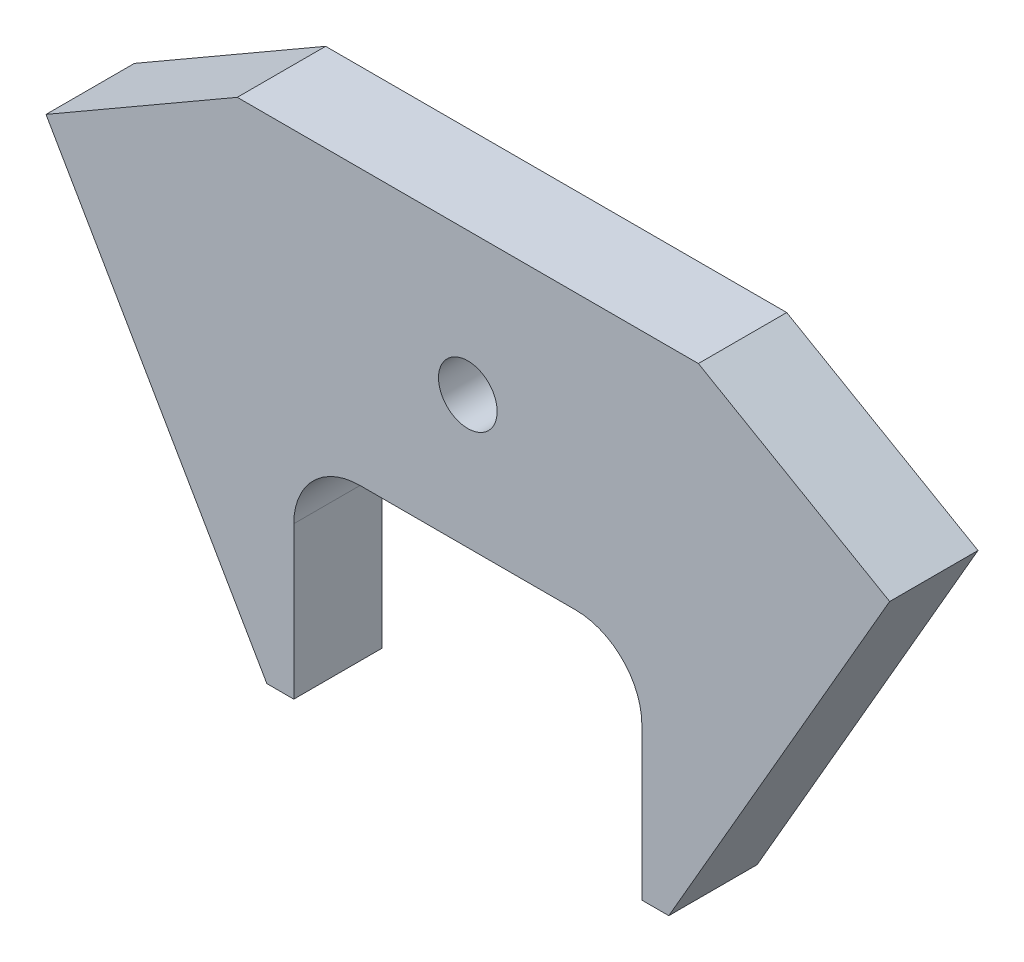
ISO-10303-21;
HEADER;
FILE_DESCRIPTION(('STEP AP214'),'2;1');
FILE_NAME('part.step','',(''),(''),'','','');
FILE_SCHEMA(('AUTOMOTIVE_DESIGN { 1 0 10303 214 1 1 1 1 }'));
ENDSEC;
DATA;
#1=APPLICATION_CONTEXT('core data for automotive mechanical design processes');
#2=APPLICATION_PROTOCOL_DEFINITION('international standard','automotive_design',2000,#1);
#3=PRODUCT_CONTEXT('',#1,'mechanical');
#4=PRODUCT('Part','Part','',(#3));
#5=PRODUCT_RELATED_PRODUCT_CATEGORY('part','',(#4));
#6=PRODUCT_DEFINITION_FORMATION('','',#4);
#7=PRODUCT_DEFINITION_CONTEXT('part definition',#1,'design');
#8=PRODUCT_DEFINITION('design','',#6,#7);
#9=PRODUCT_DEFINITION_SHAPE('','',#8);
#10=(LENGTH_UNIT() NAMED_UNIT(*) SI_UNIT(.MILLI.,.METRE.));
#11=(NAMED_UNIT(*) PLANE_ANGLE_UNIT() SI_UNIT($,.RADIAN.));
#12=(NAMED_UNIT(*) SI_UNIT($,.STERADIAN.) SOLID_ANGLE_UNIT());
#13=UNCERTAINTY_MEASURE_WITH_UNIT(LENGTH_MEASURE(1.E-05),#10,'distance_accuracy_value','');
#14=(GEOMETRIC_REPRESENTATION_CONTEXT(3) GLOBAL_UNCERTAINTY_ASSIGNED_CONTEXT((#13)) GLOBAL_UNIT_ASSIGNED_CONTEXT((#10,
#11,#12)) REPRESENTATION_CONTEXT('',''));
#15=CARTESIAN_POINT('',(0.,0.,0.));
#16=DIRECTION('',(0.,0.,1.));
#17=DIRECTION('',(1.,0.,0.));
#18=AXIS2_PLACEMENT_3D('',#15,#16,#17);
#19=CARTESIAN_POINT('',(25.019,31.369,12.7));
#20=DIRECTION('',(1.,0.,0.));
#21=DIRECTION('',(0.,0.,-1.));
#22=AXIS2_PLACEMENT_3D('',#19,#20,#21);
#23=PLANE('',#22);
#24=DIRECTION('',(0.,-1.,0.));
#25=VECTOR('',#24,1.);
#26=CARTESIAN_POINT('',(25.019,31.369,12.7));
#27=LINE('',#26,#25);
#28=CARTESIAN_POINT('',(25.019,21.844,12.7));
#29=VERTEX_POINT('',#28);
#30=CARTESIAN_POINT('',(25.019,0.,12.7));
#31=VERTEX_POINT('',#30);
#32=EDGE_CURVE('E123',#29,#31,#27,.T.);
#33=ORIENTED_EDGE('',*,*,#32,.F.);
#34=DIRECTION('',(0.,0.,-1.));
#35=VECTOR('',#34,1.);
#36=CARTESIAN_POINT('',(25.019,21.844,0.));
#37=LINE('',#36,#35);
#38=CARTESIAN_POINT('',(25.019,21.844,0.));
#39=VERTEX_POINT('',#38);
#40=EDGE_CURVE('E149',#29,#39,#37,.T.);
#41=ORIENTED_EDGE('',*,*,#40,.T.);
#42=DIRECTION('',(0.,-1.,0.));
#43=VECTOR('',#42,1.);
#44=CARTESIAN_POINT('',(25.019,31.369,0.));
#45=LINE('',#44,#43);
#46=CARTESIAN_POINT('',(25.019,0.,0.));
#47=VERTEX_POINT('',#46);
#48=EDGE_CURVE('E147',#39,#47,#45,.T.);
#49=ORIENTED_EDGE('',*,*,#48,.T.);
#50=DIRECTION('',(0.,0.,-1.));
#51=VECTOR('',#50,1.);
#52=CARTESIAN_POINT('',(25.019,0.,12.7));
#53=LINE('',#52,#51);
#54=EDGE_CURVE('E140',#31,#47,#53,.T.);
#55=ORIENTED_EDGE('',*,*,#54,.F.);
#56=EDGE_LOOP('',(#33,#41,#49,#55));
#57=FACE_BOUND('',#56,.T.);
#58=ADVANCED_FACE('F35',(#57),#23,.F.);
#59=CARTESIAN_POINT('',(25.019,0.,12.7));
#60=DIRECTION('',(0.,1.,0.));
#61=DIRECTION('',(-1.,0.,0.));
#62=AXIS2_PLACEMENT_3D('',#59,#60,#61);
#63=PLANE('',#62);
#64=DIRECTION('',(1.,0.,0.));
#65=VECTOR('',#64,1.);
#66=CARTESIAN_POINT('',(25.019,0.,0.));
#67=LINE('',#66,#65);
#68=CARTESIAN_POINT('',(28.8894527697106,0.,0.));
#69=VERTEX_POINT('',#68);
#70=EDGE_CURVE('E254',#47,#69,#67,.T.);
#71=ORIENTED_EDGE('',*,*,#70,.T.);
#72=DIRECTION('',(0.,0.,-1.));
#73=VECTOR('',#72,1.);
#74=CARTESIAN_POINT('',(28.8894527697106,0.,12.7));
#75=LINE('',#74,#73);
#76=CARTESIAN_POINT('',(28.8894527697106,0.,12.7));
#77=VERTEX_POINT('',#76);
#78=EDGE_CURVE('E142',#77,#69,#75,.T.);
#79=ORIENTED_EDGE('',*,*,#78,.F.);
#80=DIRECTION('',(1.,0.,0.));
#81=VECTOR('',#80,1.);
#82=CARTESIAN_POINT('',(25.019,0.,12.7));
#83=LINE('',#82,#81);
#84=EDGE_CURVE('E127',#31,#77,#83,.T.);
#85=ORIENTED_EDGE('',*,*,#84,.F.);
#86=ORIENTED_EDGE('',*,*,#54,.T.);
#87=EDGE_LOOP('',(#71,#79,#85,#86));
#88=FACE_BOUND('',#87,.T.);
#89=ADVANCED_FACE('F139',(#88),#63,.F.);
#90=CARTESIAN_POINT('',(28.8894527697106,0.,12.7));
#91=DIRECTION('',(-0.866025403784438,0.500000000000001,0.));
#92=DIRECTION('',(-0.500000000000001,-0.866025403784438,0.));
#93=AXIS2_PLACEMENT_3D('',#90,#91,#92);
#94=PLANE('',#93);
#95=DIRECTION('',(0.500000000000001,0.866025403784438,0.));
#96=VECTOR('',#95,1.);
#97=CARTESIAN_POINT('',(28.8894527697106,0.,0.));
#98=LINE('',#97,#96);
#99=CARTESIAN_POINT('',(60.6394527697106,54.9926131403119,0.));
#100=VERTEX_POINT('',#99);
#101=EDGE_CURVE('E256',#69,#100,#98,.T.);
#102=ORIENTED_EDGE('',*,*,#101,.T.);
#103=DIRECTION('',(0.,0.,-1.));
#104=VECTOR('',#103,1.);
#105=CARTESIAN_POINT('',(60.6394527697106,54.9926131403119,12.7));
#106=LINE('',#105,#104);
#107=CARTESIAN_POINT('',(60.6394527697106,54.9926131403119,12.7));
#108=VERTEX_POINT('',#107);
#109=EDGE_CURVE('E153',#108,#100,#106,.T.);
#110=ORIENTED_EDGE('',*,*,#109,.F.);
#111=DIRECTION('',(0.500000000000001,0.866025403784438,0.));
#112=VECTOR('',#111,1.);
#113=CARTESIAN_POINT('',(28.8894527697106,0.,12.7));
#114=LINE('',#113,#112);
#115=EDGE_CURVE('E144',#77,#108,#114,.T.);
#116=ORIENTED_EDGE('',*,*,#115,.F.);
#117=ORIENTED_EDGE('',*,*,#78,.T.);
#118=EDGE_LOOP('',(#102,#110,#116,#117));
#119=FACE_BOUND('',#118,.T.);
#120=ADVANCED_FACE('F189',(#119),#94,.F.);
#121=CARTESIAN_POINT('',(33.1431461995548,70.867613140312,12.7));
#122=DIRECTION('',(-0.500000000000002,-0.866025403784438,0.));
#123=DIRECTION('',(0.866025403784438,-0.500000000000002,0.));
#124=AXIS2_PLACEMENT_3D('',#121,#122,#123);
#125=PLANE('',#124);
#126=DIRECTION('',(-0.866025403784438,0.500000000000002,0.));
#127=VECTOR('',#126,1.);
#128=CARTESIAN_POINT('',(33.1431461995548,70.867613140312,0.));
#129=LINE('',#128,#127);
#130=CARTESIAN_POINT('',(33.1431461995548,70.867613140312,0.));
#131=VERTEX_POINT('',#130);
#132=EDGE_CURVE('E258',#100,#131,#129,.T.);
#133=ORIENTED_EDGE('',*,*,#132,.T.);
#134=DIRECTION('',(0.,0.,-1.));
#135=VECTOR('',#134,1.);
#136=CARTESIAN_POINT('',(33.1431461995548,70.867613140312,12.7));
#137=LINE('',#136,#135);
#138=CARTESIAN_POINT('',(33.1431461995548,70.867613140312,12.7));
#139=VERTEX_POINT('',#138);
#140=EDGE_CURVE('E280',#139,#131,#137,.T.);
#141=ORIENTED_EDGE('',*,*,#140,.F.);
#142=DIRECTION('',(-0.866025403784438,0.500000000000002,0.));
#143=VECTOR('',#142,1.);
#144=CARTESIAN_POINT('',(33.1431461995548,70.867613140312,12.7));
#145=LINE('',#144,#143);
#146=EDGE_CURVE('E238',#108,#139,#145,.T.);
#147=ORIENTED_EDGE('',*,*,#146,.F.);
#148=ORIENTED_EDGE('',*,*,#109,.T.);
#149=EDGE_LOOP('',(#133,#141,#147,#148));
#150=FACE_BOUND('',#149,.T.);
#151=ADVANCED_FACE('F194',(#150),#125,.F.);
#152=CARTESIAN_POINT('',(-33.1431461995548,70.867613140312,12.7));
#153=DIRECTION('',(0.,-1.,0.));
#154=DIRECTION('',(0.,0.,-1.));
#155=AXIS2_PLACEMENT_3D('',#152,#153,#154);
#156=PLANE('',#155);
#157=DIRECTION('',(-1.,0.,0.));
#158=VECTOR('',#157,1.);
#159=CARTESIAN_POINT('',(-33.1431461995548,70.867613140312,0.));
#160=LINE('',#159,#158);
#161=CARTESIAN_POINT('',(-33.1431461995548,70.867613140312,0.));
#162=VERTEX_POINT('',#161);
#163=EDGE_CURVE('E260',#131,#162,#160,.T.);
#164=ORIENTED_EDGE('',*,*,#163,.T.);
#165=DIRECTION('',(0.,0.,-1.));
#166=VECTOR('',#165,1.);
#167=CARTESIAN_POINT('',(-33.1431461995548,70.867613140312,12.7));
#168=LINE('',#167,#166);
#169=CARTESIAN_POINT('',(-33.1431461995548,70.867613140312,12.7));
#170=VERTEX_POINT('',#169);
#171=EDGE_CURVE('E277',#170,#162,#168,.T.);
#172=ORIENTED_EDGE('',*,*,#171,.F.);
#173=DIRECTION('',(-1.,0.,0.));
#174=VECTOR('',#173,1.);
#175=CARTESIAN_POINT('',(-33.1431461995548,70.867613140312,12.7));
#176=LINE('',#175,#174);
#177=EDGE_CURVE('E240',#139,#170,#176,.T.);
#178=ORIENTED_EDGE('',*,*,#177,.F.);
#179=ORIENTED_EDGE('',*,*,#140,.T.);
#180=EDGE_LOOP('',(#164,#172,#178,#179));
#181=FACE_BOUND('',#180,.T.);
#182=ADVANCED_FACE('F198',(#181),#156,.F.);
#183=CARTESIAN_POINT('',(-60.6394527697106,54.9926131403119,12.7));
#184=DIRECTION('',(0.500000000000002,-0.866025403784438,0.));
#185=DIRECTION('',(0.866025403784438,0.500000000000002,0.));
#186=AXIS2_PLACEMENT_3D('',#183,#184,#185);
#187=PLANE('',#186);
#188=DIRECTION('',(-0.866025403784438,-0.500000000000002,0.));
#189=VECTOR('',#188,1.);
#190=CARTESIAN_POINT('',(-60.6394527697106,54.9926131403119,0.));
#191=LINE('',#190,#189);
#192=CARTESIAN_POINT('',(-60.6394527697106,54.9926131403119,0.));
#193=VERTEX_POINT('',#192);
#194=EDGE_CURVE('E262',#162,#193,#191,.T.);
#195=ORIENTED_EDGE('',*,*,#194,.T.);
#196=DIRECTION('',(0.,0.,-1.));
#197=VECTOR('',#196,1.);
#198=CARTESIAN_POINT('',(-60.6394527697106,54.9926131403119,12.7));
#199=LINE('',#198,#197);
#200=CARTESIAN_POINT('',(-60.6394527697106,54.9926131403119,12.7));
#201=VERTEX_POINT('',#200);
#202=EDGE_CURVE('E274',#201,#193,#199,.T.);
#203=ORIENTED_EDGE('',*,*,#202,.F.);
#204=DIRECTION('',(-0.866025403784438,-0.500000000000002,0.));
#205=VECTOR('',#204,1.);
#206=CARTESIAN_POINT('',(-60.6394527697106,54.9926131403119,12.7));
#207=LINE('',#206,#205);
#208=EDGE_CURVE('E242',#170,#201,#207,.T.);
#209=ORIENTED_EDGE('',*,*,#208,.F.);
#210=ORIENTED_EDGE('',*,*,#171,.T.);
#211=EDGE_LOOP('',(#195,#203,#209,#210));
#212=FACE_BOUND('',#211,.T.);
#213=ADVANCED_FACE('F202',(#212),#187,.F.);
#214=CARTESIAN_POINT('',(-28.8894527697106,0.,12.7));
#215=DIRECTION('',(0.866025403784438,0.500000000000001,0.));
#216=DIRECTION('',(-0.500000000000001,0.866025403784438,0.));
#217=AXIS2_PLACEMENT_3D('',#214,#215,#216);
#218=PLANE('',#217);
#219=DIRECTION('',(0.500000000000001,-0.866025403784438,0.));
#220=VECTOR('',#219,1.);
#221=CARTESIAN_POINT('',(-28.8894527697106,0.,0.));
#222=LINE('',#221,#220);
#223=CARTESIAN_POINT('',(-28.8894527697106,0.,0.));
#224=VERTEX_POINT('',#223);
#225=EDGE_CURVE('E264',#193,#224,#222,.T.);
#226=ORIENTED_EDGE('',*,*,#225,.T.);
#227=DIRECTION('',(0.,0.,-1.));
#228=VECTOR('',#227,1.);
#229=CARTESIAN_POINT('',(-28.8894527697106,0.,12.7));
#230=LINE('',#229,#228);
#231=CARTESIAN_POINT('',(-28.8894527697106,0.,12.7));
#232=VERTEX_POINT('',#231);
#233=EDGE_CURVE('E271',#232,#224,#230,.T.);
#234=ORIENTED_EDGE('',*,*,#233,.F.);
#235=DIRECTION('',(0.500000000000001,-0.866025403784438,0.));
#236=VECTOR('',#235,1.);
#237=CARTESIAN_POINT('',(-28.8894527697106,0.,12.7));
#238=LINE('',#237,#236);
#239=EDGE_CURVE('E244',#201,#232,#238,.T.);
#240=ORIENTED_EDGE('',*,*,#239,.F.);
#241=ORIENTED_EDGE('',*,*,#202,.T.);
#242=EDGE_LOOP('',(#226,#234,#240,#241));
#243=FACE_BOUND('',#242,.T.);
#244=ADVANCED_FACE('F206',(#243),#218,.F.);
#245=CARTESIAN_POINT('',(-25.019,0.,12.7));
#246=DIRECTION('',(0.,1.,0.));
#247=DIRECTION('',(-1.,0.,0.));
#248=AXIS2_PLACEMENT_3D('',#245,#246,#247);
#249=PLANE('',#248);
#250=DIRECTION('',(1.,0.,0.));
#251=VECTOR('',#250,1.);
#252=CARTESIAN_POINT('',(-25.019,0.,0.));
#253=LINE('',#252,#251);
#254=CARTESIAN_POINT('',(-25.019,0.,0.));
#255=VERTEX_POINT('',#254);
#256=EDGE_CURVE('E266',#224,#255,#253,.T.);
#257=ORIENTED_EDGE('',*,*,#256,.T.);
#258=DIRECTION('',(0.,0.,-1.));
#259=VECTOR('',#258,1.);
#260=CARTESIAN_POINT('',(-25.019,0.,12.7));
#261=LINE('',#260,#259);
#262=CARTESIAN_POINT('',(-25.019,0.,12.7));
#263=VERTEX_POINT('',#262);
#264=EDGE_CURVE('E252',#263,#255,#261,.T.);
#265=ORIENTED_EDGE('',*,*,#264,.F.);
#266=DIRECTION('',(1.,0.,0.));
#267=VECTOR('',#266,1.);
#268=CARTESIAN_POINT('',(-25.019,0.,12.7));
#269=LINE('',#268,#267);
#270=EDGE_CURVE('E246',#232,#263,#269,.T.);
#271=ORIENTED_EDGE('',*,*,#270,.F.);
#272=ORIENTED_EDGE('',*,*,#233,.T.);
#273=EDGE_LOOP('',(#257,#265,#271,#272));
#274=FACE_BOUND('',#273,.T.);
#275=ADVANCED_FACE('F210',(#274),#249,.F.);
#276=CARTESIAN_POINT('',(-25.019,0.,12.7));
#277=DIRECTION('',(-1.,0.,0.));
#278=DIRECTION('',(0.,0.,1.));
#279=AXIS2_PLACEMENT_3D('',#276,#277,#278);
#280=PLANE('',#279);
#281=DIRECTION('',(0.,1.,0.));
#282=VECTOR('',#281,1.);
#283=CARTESIAN_POINT('',(-25.019,0.,0.));
#284=LINE('',#283,#282);
#285=CARTESIAN_POINT('',(-25.019,21.844,0.));
#286=VERTEX_POINT('',#285);
#287=EDGE_CURVE('E172',#255,#286,#284,.T.);
#288=ORIENTED_EDGE('',*,*,#287,.T.);
#289=DIRECTION('',(0.,0.,-1.));
#290=VECTOR('',#289,1.);
#291=CARTESIAN_POINT('',(-25.019,21.844,12.7));
#292=LINE('',#291,#290);
#293=CARTESIAN_POINT('',(-25.019,21.844,12.7));
#294=VERTEX_POINT('',#293);
#295=EDGE_CURVE('E50',#286,#294,#292,.F.);
#296=ORIENTED_EDGE('',*,*,#295,.T.);
#297=DIRECTION('',(0.,1.,0.));
#298=VECTOR('',#297,1.);
#299=CARTESIAN_POINT('',(-25.019,0.,12.7));
#300=LINE('',#299,#298);
#301=EDGE_CURVE('E248',#263,#294,#300,.T.);
#302=ORIENTED_EDGE('',*,*,#301,.F.);
#303=ORIENTED_EDGE('',*,*,#264,.T.);
#304=EDGE_LOOP('',(#288,#296,#302,#303));
#305=FACE_BOUND('',#304,.T.);
#306=ADVANCED_FACE('F214',(#305),#280,.F.);
#307=CARTESIAN_POINT('',(-25.019,31.369,12.7));
#308=DIRECTION('',(0.,1.,0.));
#309=DIRECTION('',(0.,0.,1.));
#310=AXIS2_PLACEMENT_3D('',#307,#308,#309);
#311=PLANE('',#310);
#312=DIRECTION('',(1.,0.,0.));
#313=VECTOR('',#312,1.);
#314=CARTESIAN_POINT('',(-25.019,31.369,0.));
#315=LINE('',#314,#313);
#316=CARTESIAN_POINT('',(-15.494,31.369,0.));
#317=VERTEX_POINT('',#316);
#318=CARTESIAN_POINT('',(15.494,31.369,0.));
#319=VERTEX_POINT('',#318);
#320=EDGE_CURVE('E135',#317,#319,#315,.T.);
#321=ORIENTED_EDGE('',*,*,#320,.T.);
#322=DIRECTION('',(0.,0.,-1.));
#323=VECTOR('',#322,1.);
#324=CARTESIAN_POINT('',(15.494,31.369,12.7));
#325=LINE('',#324,#323);
#326=CARTESIAN_POINT('',(15.494,31.369,12.7));
#327=VERTEX_POINT('',#326);
#328=EDGE_CURVE('E159',#319,#327,#325,.F.);
#329=ORIENTED_EDGE('',*,*,#328,.T.);
#330=DIRECTION('',(1.,0.,0.));
#331=VECTOR('',#330,1.);
#332=CARTESIAN_POINT('',(-25.019,31.369,12.7));
#333=LINE('',#332,#331);
#334=CARTESIAN_POINT('',(-15.494,31.369,12.7));
#335=VERTEX_POINT('',#334);
#336=EDGE_CURVE('E250',#335,#327,#333,.T.);
#337=ORIENTED_EDGE('',*,*,#336,.F.);
#338=DIRECTION('',(0.,0.,-1.));
#339=VECTOR('',#338,1.);
#340=CARTESIAN_POINT('',(-15.494,31.369,0.));
#341=LINE('',#340,#339);
#342=EDGE_CURVE('E151',#335,#317,#341,.T.);
#343=ORIENTED_EDGE('',*,*,#342,.T.);
#344=EDGE_LOOP('',(#321,#329,#337,#343));
#345=FACE_BOUND('',#344,.T.);
#346=ADVANCED_FACE('F169',(#345),#311,.F.);
#347=CARTESIAN_POINT('',(0.,0.,12.7));
#348=DIRECTION('',(0.,0.,1.));
#349=DIRECTION('',(1.,0.,0.));
#350=AXIS2_PLACEMENT_3D('',#347,#348,#349);
#351=PLANE('',#350);
#352=CARTESIAN_POINT('',(0.,50.419,12.7));
#353=DIRECTION('',(0.,0.,-1.));
#354=DIRECTION('',(-1.,0.,0.));
#355=AXIS2_PLACEMENT_3D('',#352,#353,#354);
#356=CIRCLE('',#355,4.2164);
#357=CARTESIAN_POINT('',(-4.21639999999999,50.419,12.7));
#358=VERTEX_POINT('',#357);
#359=EDGE_CURVE('E230',#358,#358,#356,.T.);
#360=ORIENTED_EDGE('',*,*,#359,.T.);
#361=EDGE_LOOP('',(#360));
#362=FACE_BOUND('',#361,.T.);
#363=ORIENTED_EDGE('',*,*,#336,.T.);
#364=CARTESIAN_POINT('',(15.494,21.844,12.7));
#365=DIRECTION('',(0.,0.,1.));
#366=DIRECTION('',(1.,0.,0.));
#367=AXIS2_PLACEMENT_3D('',#364,#365,#366);
#368=CIRCLE('',#367,9.525);
#369=EDGE_CURVE('E130',#327,#29,#368,.F.);
#370=ORIENTED_EDGE('',*,*,#369,.T.);
#371=ORIENTED_EDGE('',*,*,#32,.T.);
#372=ORIENTED_EDGE('',*,*,#84,.T.);
#373=ORIENTED_EDGE('',*,*,#115,.T.);
#374=ORIENTED_EDGE('',*,*,#146,.T.);
#375=ORIENTED_EDGE('',*,*,#177,.T.);
#376=ORIENTED_EDGE('',*,*,#208,.T.);
#377=ORIENTED_EDGE('',*,*,#239,.T.);
#378=ORIENTED_EDGE('',*,*,#270,.T.);
#379=ORIENTED_EDGE('',*,*,#301,.T.);
#380=CARTESIAN_POINT('',(-15.494,21.844,12.7));
#381=DIRECTION('',(0.,0.,1.));
#382=DIRECTION('',(1.,0.,0.));
#383=AXIS2_PLACEMENT_3D('',#380,#381,#382);
#384=CIRCLE('',#383,9.525);
#385=EDGE_CURVE('E11',#294,#335,#384,.F.);
#386=ORIENTED_EDGE('',*,*,#385,.T.);
#387=EDGE_LOOP('',(#363,#370,#371,#372,#373,#374,#375,#376,#377,#378,#379,#386));
#388=FACE_BOUND('',#387,.T.);
#389=ADVANCED_FACE('F126',(#362,#388),#351,.T.);
#390=CARTESIAN_POINT('',(0.,0.,0.));
#391=DIRECTION('',(0.,0.,1.));
#392=DIRECTION('',(1.,0.,0.));
#393=AXIS2_PLACEMENT_3D('',#390,#391,#392);
#394=PLANE('',#393);
#395=CARTESIAN_POINT('',(0.,50.419,0.));
#396=DIRECTION('',(0.,0.,-1.));
#397=DIRECTION('',(-1.,0.,0.));
#398=AXIS2_PLACEMENT_3D('',#395,#396,#397);
#399=CIRCLE('',#398,4.2164);
#400=CARTESIAN_POINT('',(-4.2164,50.419,0.));
#401=VERTEX_POINT('',#400);
#402=EDGE_CURVE('E233',#401,#401,#399,.T.);
#403=ORIENTED_EDGE('',*,*,#402,.F.);
#404=EDGE_LOOP('',(#403));
#405=FACE_BOUND('',#404,.T.);
#406=ORIENTED_EDGE('',*,*,#48,.F.);
#407=CARTESIAN_POINT('',(15.494,21.844,0.));
#408=DIRECTION('',(0.,0.,1.));
#409=DIRECTION('',(1.,0.,0.));
#410=AXIS2_PLACEMENT_3D('',#407,#408,#409);
#411=CIRCLE('',#410,9.525);
#412=EDGE_CURVE('E162',#39,#319,#411,.T.);
#413=ORIENTED_EDGE('',*,*,#412,.T.);
#414=ORIENTED_EDGE('',*,*,#320,.F.);
#415=CARTESIAN_POINT('',(-15.494,21.844,0.));
#416=DIRECTION('',(0.,0.,1.));
#417=DIRECTION('',(1.,0.,0.));
#418=AXIS2_PLACEMENT_3D('',#415,#416,#417);
#419=CIRCLE('',#418,9.525);
#420=EDGE_CURVE('E43',#317,#286,#419,.T.);
#421=ORIENTED_EDGE('',*,*,#420,.T.);
#422=ORIENTED_EDGE('',*,*,#287,.F.);
#423=ORIENTED_EDGE('',*,*,#256,.F.);
#424=ORIENTED_EDGE('',*,*,#225,.F.);
#425=ORIENTED_EDGE('',*,*,#194,.F.);
#426=ORIENTED_EDGE('',*,*,#163,.F.);
#427=ORIENTED_EDGE('',*,*,#132,.F.);
#428=ORIENTED_EDGE('',*,*,#101,.F.);
#429=ORIENTED_EDGE('',*,*,#70,.F.);
#430=EDGE_LOOP('',(#406,#413,#414,#421,#422,#423,#424,#425,#426,#427,#428,#429));
#431=FACE_BOUND('',#430,.T.);
#432=ADVANCED_FACE('F165',(#405,#431),#394,.F.);
#433=CARTESIAN_POINT('',(15.494,21.844,12.7));
#434=DIRECTION('',(0.,0.,1.));
#435=DIRECTION('',(1.,0.,0.));
#436=AXIS2_PLACEMENT_3D('',#433,#434,#435);
#437=CYLINDRICAL_SURFACE('',#436,9.525);
#438=ORIENTED_EDGE('',*,*,#369,.F.);
#439=ORIENTED_EDGE('',*,*,#328,.F.);
#440=ORIENTED_EDGE('',*,*,#412,.F.);
#441=ORIENTED_EDGE('',*,*,#40,.F.);
#442=EDGE_LOOP('',(#438,#439,#440,#441));
#443=FACE_BOUND('',#442,.T.);
#444=ADVANCED_FACE('F174',(#443),#437,.F.);
#445=CARTESIAN_POINT('',(-15.494,21.844,12.7));
#446=DIRECTION('',(0.,0.,1.));
#447=DIRECTION('',(1.,0.,0.));
#448=AXIS2_PLACEMENT_3D('',#445,#446,#447);
#449=CYLINDRICAL_SURFACE('',#448,9.525);
#450=ORIENTED_EDGE('',*,*,#385,.F.);
#451=ORIENTED_EDGE('',*,*,#295,.F.);
#452=ORIENTED_EDGE('',*,*,#420,.F.);
#453=ORIENTED_EDGE('',*,*,#342,.F.);
#454=EDGE_LOOP('',(#450,#451,#452,#453));
#455=FACE_BOUND('',#454,.T.);
#456=ADVANCED_FACE('F37',(#455),#449,.F.);
#457=CARTESIAN_POINT('',(0.,50.419,0.));
#458=DIRECTION('',(0.,0.,-1.));
#459=DIRECTION('',(-1.,0.,0.));
#460=AXIS2_PLACEMENT_3D('',#457,#458,#459);
#461=CYLINDRICAL_SURFACE('',#460,4.2164);
#462=ORIENTED_EDGE('',*,*,#359,.F.);
#463=EDGE_LOOP('',(#462));
#464=FACE_BOUND('',#463,.T.);
#465=ORIENTED_EDGE('',*,*,#402,.T.);
#466=EDGE_LOOP('',(#465));
#467=FACE_BOUND('',#466,.T.);
#468=ADVANCED_FACE('F180',(#464,#467),#461,.F.);
#469=CLOSED_SHELL('',(#58,#89,#120,#151,#182,#213,#244,#275,#306,#346,#389,#432,#444,#456,#468));
#470=MANIFOLD_SOLID_BREP('B2',#469);
#471=ADVANCED_BREP_SHAPE_REPRESENTATION('',(#18,#470),#14);
#472=SHAPE_DEFINITION_REPRESENTATION(#9,#471);
ENDSEC;
END-ISO-10303-21;
